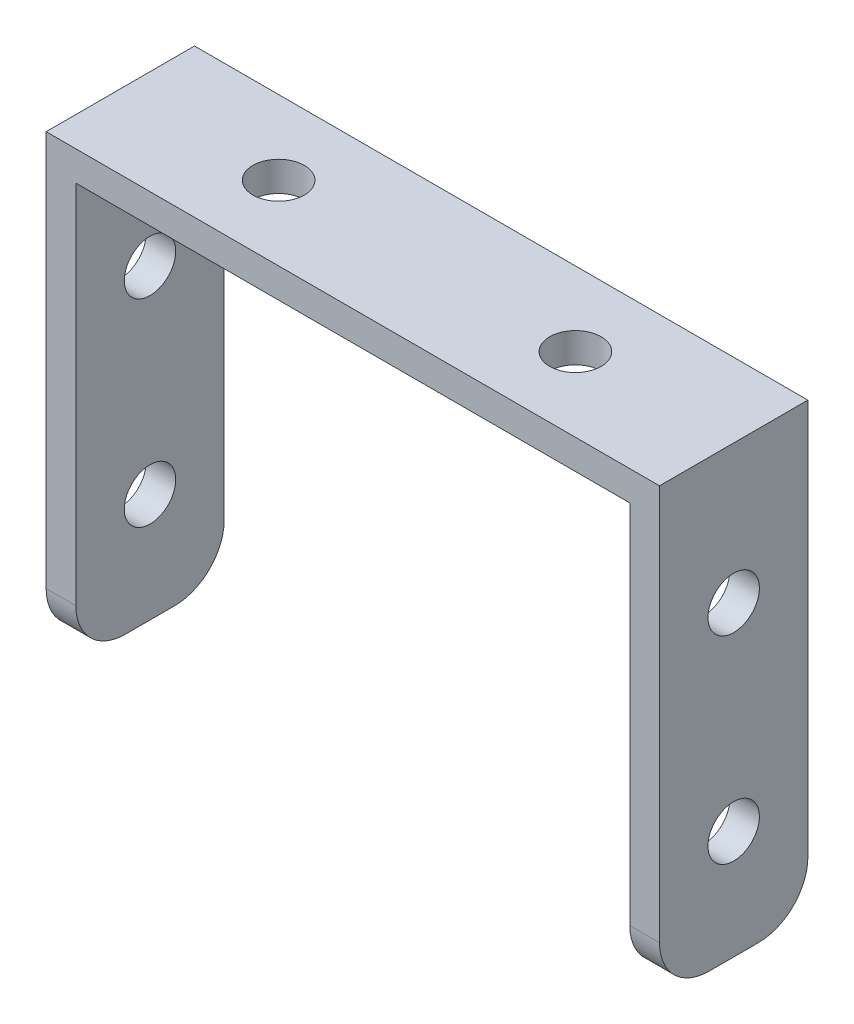
ISO-10303-21;
HEADER;
FILE_DESCRIPTION(('STEP AP214'),'2;1');
FILE_NAME('part.step','',(''),(''),'','','');
FILE_SCHEMA(('AUTOMOTIVE_DESIGN { 1 0 10303 214 1 1 1 1 }'));
ENDSEC;
DATA;
#1=APPLICATION_CONTEXT('core data for automotive mechanical design processes');
#2=APPLICATION_PROTOCOL_DEFINITION('international standard','automotive_design',2000,#1);
#3=PRODUCT_CONTEXT('',#1,'mechanical');
#4=PRODUCT('Part','Part','',(#3));
#5=PRODUCT_RELATED_PRODUCT_CATEGORY('part','',(#4));
#6=PRODUCT_DEFINITION_FORMATION('','',#4);
#7=PRODUCT_DEFINITION_CONTEXT('part definition',#1,'design');
#8=PRODUCT_DEFINITION('design','',#6,#7);
#9=PRODUCT_DEFINITION_SHAPE('','',#8);
#10=(LENGTH_UNIT() NAMED_UNIT(*) SI_UNIT(.MILLI.,.METRE.));
#11=(NAMED_UNIT(*) PLANE_ANGLE_UNIT() SI_UNIT($,.RADIAN.));
#12=(NAMED_UNIT(*) SI_UNIT($,.STERADIAN.) SOLID_ANGLE_UNIT());
#13=UNCERTAINTY_MEASURE_WITH_UNIT(LENGTH_MEASURE(1.E-05),#10,'distance_accuracy_value','');
#14=(GEOMETRIC_REPRESENTATION_CONTEXT(3) GLOBAL_UNCERTAINTY_ASSIGNED_CONTEXT((#13)) GLOBAL_UNIT_ASSIGNED_CONTEXT((#10,
#11,#12)) REPRESENTATION_CONTEXT('',''));
#15=CARTESIAN_POINT('',(0.,0.,0.));
#16=DIRECTION('',(0.,0.,1.));
#17=DIRECTION('',(1.,0.,0.));
#18=AXIS2_PLACEMENT_3D('',#15,#16,#17);
#19=CARTESIAN_POINT('',(-31.,0.,15.));
#20=DIRECTION('',(1.,0.,0.));
#21=DIRECTION('',(0.,0.,-1.));
#22=AXIS2_PLACEMENT_3D('',#19,#20,#21);
#23=PLANE('',#22);
#24=CARTESIAN_POINT('',(-31.,11.,7.5));
#25=DIRECTION('',(1.,0.,0.));
#26=DIRECTION('',(0.,0.,-1.));
#27=AXIS2_PLACEMENT_3D('',#24,#25,#26);
#28=CIRCLE('',#27,2.6);
#29=CARTESIAN_POINT('',(-31.,11.,4.9));
#30=VERTEX_POINT('',#29);
#31=EDGE_CURVE('E269',#30,#30,#28,.T.);
#32=ORIENTED_EDGE('',*,*,#31,.T.);
#33=EDGE_LOOP('',(#32));
#34=FACE_BOUND('',#33,.T.);
#35=CARTESIAN_POINT('',(-31.,31.,7.5));
#36=DIRECTION('',(1.,0.,0.));
#37=DIRECTION('',(0.,0.,-1.));
#38=AXIS2_PLACEMENT_3D('',#35,#36,#37);
#39=CIRCLE('',#38,2.6);
#40=CARTESIAN_POINT('',(-31.,31.,4.9));
#41=VERTEX_POINT('',#40);
#42=EDGE_CURVE('E273',#41,#41,#39,.T.);
#43=ORIENTED_EDGE('',*,*,#42,.T.);
#44=EDGE_LOOP('',(#43));
#45=FACE_BOUND('',#44,.T.);
#46=DIRECTION('',(0.,0.,-1.));
#47=VECTOR('',#46,1.);
#48=CARTESIAN_POINT('',(-31.,0.,15.));
#49=LINE('',#48,#47);
#50=CARTESIAN_POINT('',(-31.,0.,10.));
#51=VERTEX_POINT('',#50);
#52=CARTESIAN_POINT('',(-31.,0.,5.));
#53=VERTEX_POINT('',#52);
#54=EDGE_CURVE('E186',#51,#53,#49,.T.);
#55=ORIENTED_EDGE('',*,*,#54,.F.);
#56=CARTESIAN_POINT('',(-31.,5.,10.));
#57=DIRECTION('',(1.,0.,0.));
#58=DIRECTION('',(0.,0.,-1.));
#59=AXIS2_PLACEMENT_3D('',#56,#57,#58);
#60=CIRCLE('',#59,5.);
#61=CARTESIAN_POINT('',(-31.,5.,15.));
#62=VERTEX_POINT('',#61);
#63=EDGE_CURVE('E204',#51,#62,#60,.F.);
#64=ORIENTED_EDGE('',*,*,#63,.T.);
#65=DIRECTION('',(0.,-1.,0.));
#66=VECTOR('',#65,1.);
#67=CARTESIAN_POINT('',(-31.,0.,15.));
#68=LINE('',#67,#66);
#69=CARTESIAN_POINT('',(-31.,45.,15.));
#70=VERTEX_POINT('',#69);
#71=EDGE_CURVE('E135',#70,#62,#68,.T.);
#72=ORIENTED_EDGE('',*,*,#71,.F.);
#73=DIRECTION('',(0.,0.,-1.));
#74=VECTOR('',#73,1.);
#75=CARTESIAN_POINT('',(-31.,45.,15.));
#76=LINE('',#75,#74);
#77=CARTESIAN_POINT('',(-31.,45.,0.));
#78=VERTEX_POINT('',#77);
#79=EDGE_CURVE('E159',#70,#78,#76,.T.);
#80=ORIENTED_EDGE('',*,*,#79,.T.);
#81=DIRECTION('',(0.,-1.,0.));
#82=VECTOR('',#81,1.);
#83=CARTESIAN_POINT('',(-31.,0.,0.));
#84=LINE('',#83,#82);
#85=CARTESIAN_POINT('',(-31.,5.,0.));
#86=VERTEX_POINT('',#85);
#87=EDGE_CURVE('E160',#78,#86,#84,.T.);
#88=ORIENTED_EDGE('',*,*,#87,.T.);
#89=CARTESIAN_POINT('',(-31.,5.,5.));
#90=DIRECTION('',(1.,0.,0.));
#91=DIRECTION('',(0.,0.,-1.));
#92=AXIS2_PLACEMENT_3D('',#89,#90,#91);
#93=CIRCLE('',#92,5.);
#94=EDGE_CURVE('E202',#86,#53,#93,.F.);
#95=ORIENTED_EDGE('',*,*,#94,.T.);
#96=EDGE_LOOP('',(#55,#64,#72,#80,#88,#95));
#97=FACE_BOUND('',#96,.T.);
#98=ADVANCED_FACE('F35',(#34,#45,#97),#23,.F.);
#99=CARTESIAN_POINT('',(-31.,0.,15.));
#100=DIRECTION('',(0.,1.,0.));
#101=DIRECTION('',(-1.,0.,0.));
#102=AXIS2_PLACEMENT_3D('',#99,#100,#101);
#103=PLANE('',#102);
#104=DIRECTION('',(0.,0.,-1.));
#105=VECTOR('',#104,1.);
#106=CARTESIAN_POINT('',(-28.,0.,15.));
#107=LINE('',#106,#105);
#108=CARTESIAN_POINT('',(-28.,0.,10.));
#109=VERTEX_POINT('',#108);
#110=CARTESIAN_POINT('',(-28.,0.,5.));
#111=VERTEX_POINT('',#110);
#112=EDGE_CURVE('E144',#109,#111,#107,.T.);
#113=ORIENTED_EDGE('',*,*,#112,.F.);
#114=DIRECTION('',(1.,0.,0.));
#115=VECTOR('',#114,1.);
#116=CARTESIAN_POINT('',(-31.,0.,10.));
#117=LINE('',#116,#115);
#118=EDGE_CURVE('E200',#109,#51,#117,.F.);
#119=ORIENTED_EDGE('',*,*,#118,.T.);
#120=ORIENTED_EDGE('',*,*,#54,.T.);
#121=DIRECTION('',(1.,0.,0.));
#122=VECTOR('',#121,1.);
#123=CARTESIAN_POINT('',(-28.,0.,5.));
#124=LINE('',#123,#122);
#125=EDGE_CURVE('E197',#53,#111,#124,.T.);
#126=ORIENTED_EDGE('',*,*,#125,.T.);
#127=EDGE_LOOP('',(#113,#119,#120,#126));
#128=FACE_BOUND('',#127,.T.);
#129=ADVANCED_FACE('F295',(#128),#103,.F.);
#130=CARTESIAN_POINT('',(-28.,0.,15.));
#131=DIRECTION('',(-1.,0.,0.));
#132=DIRECTION('',(0.,0.,1.));
#133=AXIS2_PLACEMENT_3D('',#130,#131,#132);
#134=PLANE('',#133);
#135=CARTESIAN_POINT('',(-28.,11.,7.5));
#136=DIRECTION('',(-1.,0.,0.));
#137=DIRECTION('',(0.,0.,1.));
#138=AXIS2_PLACEMENT_3D('',#135,#136,#137);
#139=CIRCLE('',#138,2.6);
#140=CARTESIAN_POINT('',(-28.,11.,10.1));
#141=VERTEX_POINT('',#140);
#142=EDGE_CURVE('E255',#141,#141,#139,.T.);
#143=ORIENTED_EDGE('',*,*,#142,.T.);
#144=EDGE_LOOP('',(#143));
#145=FACE_BOUND('',#144,.T.);
#146=CARTESIAN_POINT('',(-28.,31.,7.5));
#147=DIRECTION('',(-1.,0.,0.));
#148=DIRECTION('',(0.,0.,1.));
#149=AXIS2_PLACEMENT_3D('',#146,#147,#148);
#150=CIRCLE('',#149,2.6);
#151=CARTESIAN_POINT('',(-28.,31.,10.1));
#152=VERTEX_POINT('',#151);
#153=EDGE_CURVE('E263',#152,#152,#150,.T.);
#154=ORIENTED_EDGE('',*,*,#153,.T.);
#155=EDGE_LOOP('',(#154));
#156=FACE_BOUND('',#155,.T.);
#157=DIRECTION('',(0.,1.,0.));
#158=VECTOR('',#157,1.);
#159=CARTESIAN_POINT('',(-28.,0.,15.));
#160=LINE('',#159,#158);
#161=CARTESIAN_POINT('',(-28.,5.,15.));
#162=VERTEX_POINT('',#161);
#163=CARTESIAN_POINT('',(-28.,42.,15.));
#164=VERTEX_POINT('',#163);
#165=EDGE_CURVE('E124',#162,#164,#160,.T.);
#166=ORIENTED_EDGE('',*,*,#165,.F.);
#167=CARTESIAN_POINT('',(-28.,5.,10.));
#168=DIRECTION('',(-1.,0.,0.));
#169=DIRECTION('',(0.,0.,1.));
#170=AXIS2_PLACEMENT_3D('',#167,#168,#169);
#171=CIRCLE('',#170,5.);
#172=EDGE_CURVE('E195',#162,#109,#171,.F.);
#173=ORIENTED_EDGE('',*,*,#172,.T.);
#174=ORIENTED_EDGE('',*,*,#112,.T.);
#175=CARTESIAN_POINT('',(-28.,5.,5.));
#176=DIRECTION('',(-1.,0.,0.));
#177=DIRECTION('',(0.,0.,1.));
#178=AXIS2_PLACEMENT_3D('',#175,#176,#177);
#179=CIRCLE('',#178,5.);
#180=CARTESIAN_POINT('',(-28.,5.,0.));
#181=VERTEX_POINT('',#180);
#182=EDGE_CURVE('E193',#111,#181,#179,.F.);
#183=ORIENTED_EDGE('',*,*,#182,.T.);
#184=DIRECTION('',(0.,1.,0.));
#185=VECTOR('',#184,1.);
#186=CARTESIAN_POINT('',(-28.,0.,0.));
#187=LINE('',#186,#185);
#188=CARTESIAN_POINT('',(-28.,42.,0.));
#189=VERTEX_POINT('',#188);
#190=EDGE_CURVE('E141',#181,#189,#187,.T.);
#191=ORIENTED_EDGE('',*,*,#190,.T.);
#192=DIRECTION('',(0.,0.,-1.));
#193=VECTOR('',#192,1.);
#194=CARTESIAN_POINT('',(-28.,42.,15.));
#195=LINE('',#194,#193);
#196=EDGE_CURVE('E138',#164,#189,#195,.T.);
#197=ORIENTED_EDGE('',*,*,#196,.F.);
#198=EDGE_LOOP('',(#166,#173,#174,#183,#191,#197));
#199=FACE_BOUND('',#198,.T.);
#200=ADVANCED_FACE('F139',(#145,#156,#199),#134,.F.);
#201=CARTESIAN_POINT('',(-28.,42.,15.));
#202=DIRECTION('',(0.,1.,0.));
#203=DIRECTION('',(0.,0.,1.));
#204=AXIS2_PLACEMENT_3D('',#201,#202,#203);
#205=PLANE('',#204);
#206=CARTESIAN_POINT('',(-15.,42.,7.5));
#207=DIRECTION('',(0.,1.,0.));
#208=DIRECTION('',(0.,0.,1.));
#209=AXIS2_PLACEMENT_3D('',#206,#207,#208);
#210=CIRCLE('',#209,2.6);
#211=CARTESIAN_POINT('',(-15.,42.,10.1));
#212=VERTEX_POINT('',#211);
#213=EDGE_CURVE('E163',#212,#212,#210,.T.);
#214=ORIENTED_EDGE('',*,*,#213,.T.);
#215=EDGE_LOOP('',(#214));
#216=FACE_BOUND('',#215,.T.);
#217=CARTESIAN_POINT('',(15.,42.,7.5));
#218=DIRECTION('',(0.,1.,0.));
#219=DIRECTION('',(0.,0.,1.));
#220=AXIS2_PLACEMENT_3D('',#217,#218,#219);
#221=CIRCLE('',#220,2.6);
#222=CARTESIAN_POINT('',(15.,42.,10.1));
#223=VERTEX_POINT('',#222);
#224=EDGE_CURVE('E248',#223,#223,#221,.T.);
#225=ORIENTED_EDGE('',*,*,#224,.T.);
#226=EDGE_LOOP('',(#225));
#227=FACE_BOUND('',#226,.T.);
#228=DIRECTION('',(1.,0.,0.));
#229=VECTOR('',#228,1.);
#230=CARTESIAN_POINT('',(-28.,42.,0.));
#231=LINE('',#230,#229);
#232=CARTESIAN_POINT('',(28.,42.,0.));
#233=VERTEX_POINT('',#232);
#234=EDGE_CURVE('E165',#189,#233,#231,.T.);
#235=ORIENTED_EDGE('',*,*,#234,.T.);
#236=DIRECTION('',(0.,0.,-1.));
#237=VECTOR('',#236,1.);
#238=CARTESIAN_POINT('',(28.,42.,15.));
#239=LINE('',#238,#237);
#240=CARTESIAN_POINT('',(28.,42.,15.));
#241=VERTEX_POINT('',#240);
#242=EDGE_CURVE('E145',#241,#233,#239,.T.);
#243=ORIENTED_EDGE('',*,*,#242,.F.);
#244=DIRECTION('',(1.,0.,0.));
#245=VECTOR('',#244,1.);
#246=CARTESIAN_POINT('',(-28.,42.,15.));
#247=LINE('',#246,#245);
#248=EDGE_CURVE('E130',#164,#241,#247,.T.);
#249=ORIENTED_EDGE('',*,*,#248,.F.);
#250=ORIENTED_EDGE('',*,*,#196,.T.);
#251=EDGE_LOOP('',(#235,#243,#249,#250));
#252=FACE_BOUND('',#251,.T.);
#253=ADVANCED_FACE('F147',(#216,#227,#252),#205,.F.);
#254=CARTESIAN_POINT('',(28.,0.,15.));
#255=DIRECTION('',(1.,0.,0.));
#256=DIRECTION('',(0.,0.,-1.));
#257=AXIS2_PLACEMENT_3D('',#254,#255,#256);
#258=PLANE('',#257);
#259=CARTESIAN_POINT('',(28.,11.,7.5));
#260=DIRECTION('',(1.,0.,0.));
#261=DIRECTION('',(0.,0.,-1.));
#262=AXIS2_PLACEMENT_3D('',#259,#260,#261);
#263=CIRCLE('',#262,2.6);
#264=CARTESIAN_POINT('',(28.,11.,4.9));
#265=VERTEX_POINT('',#264);
#266=EDGE_CURVE('E260',#265,#265,#263,.T.);
#267=ORIENTED_EDGE('',*,*,#266,.T.);
#268=EDGE_LOOP('',(#267));
#269=FACE_BOUND('',#268,.T.);
#270=CARTESIAN_POINT('',(28.,31.,7.5));
#271=DIRECTION('',(1.,0.,0.));
#272=DIRECTION('',(0.,0.,-1.));
#273=AXIS2_PLACEMENT_3D('',#270,#271,#272);
#274=CIRCLE('',#273,2.6);
#275=CARTESIAN_POINT('',(28.,31.,4.9));
#276=VERTEX_POINT('',#275);
#277=EDGE_CURVE('E266',#276,#276,#274,.T.);
#278=ORIENTED_EDGE('',*,*,#277,.T.);
#279=EDGE_LOOP('',(#278));
#280=FACE_BOUND('',#279,.T.);
#281=DIRECTION('',(0.,-1.,0.));
#282=VECTOR('',#281,1.);
#283=CARTESIAN_POINT('',(28.,0.,0.));
#284=LINE('',#283,#282);
#285=CARTESIAN_POINT('',(28.,5.,0.));
#286=VERTEX_POINT('',#285);
#287=EDGE_CURVE('E167',#233,#286,#284,.T.);
#288=ORIENTED_EDGE('',*,*,#287,.T.);
#289=CARTESIAN_POINT('',(28.,5.,5.));
#290=DIRECTION('',(1.,0.,0.));
#291=DIRECTION('',(0.,0.,-1.));
#292=AXIS2_PLACEMENT_3D('',#289,#290,#291);
#293=CIRCLE('',#292,5.);
#294=CARTESIAN_POINT('',(28.,0.,5.));
#295=VERTEX_POINT('',#294);
#296=EDGE_CURVE('E11',#286,#295,#293,.F.);
#297=ORIENTED_EDGE('',*,*,#296,.T.);
#298=DIRECTION('',(0.,0.,-1.));
#299=VECTOR('',#298,1.);
#300=CARTESIAN_POINT('',(28.,0.,15.));
#301=LINE('',#300,#299);
#302=CARTESIAN_POINT('',(28.,0.,10.));
#303=VERTEX_POINT('',#302);
#304=EDGE_CURVE('E181',#303,#295,#301,.T.);
#305=ORIENTED_EDGE('',*,*,#304,.F.);
#306=CARTESIAN_POINT('',(28.,5.,10.));
#307=DIRECTION('',(1.,0.,0.));
#308=DIRECTION('',(0.,0.,-1.));
#309=AXIS2_PLACEMENT_3D('',#306,#307,#308);
#310=CIRCLE('',#309,5.);
#311=CARTESIAN_POINT('',(28.,5.,15.));
#312=VERTEX_POINT('',#311);
#313=EDGE_CURVE('E43',#303,#312,#310,.F.);
#314=ORIENTED_EDGE('',*,*,#313,.T.);
#315=DIRECTION('',(0.,-1.,0.));
#316=VECTOR('',#315,1.);
#317=CARTESIAN_POINT('',(28.,0.,15.));
#318=LINE('',#317,#316);
#319=EDGE_CURVE('E150',#241,#312,#318,.T.);
#320=ORIENTED_EDGE('',*,*,#319,.F.);
#321=ORIENTED_EDGE('',*,*,#242,.T.);
#322=EDGE_LOOP('',(#288,#297,#305,#314,#320,#321));
#323=FACE_BOUND('',#322,.T.);
#324=ADVANCED_FACE('F218',(#269,#280,#323),#258,.F.);
#325=CARTESIAN_POINT('',(31.,0.,15.));
#326=DIRECTION('',(0.,1.,0.));
#327=DIRECTION('',(-1.,0.,0.));
#328=AXIS2_PLACEMENT_3D('',#325,#326,#327);
#329=PLANE('',#328);
#330=ORIENTED_EDGE('',*,*,#304,.T.);
#331=DIRECTION('',(1.,0.,0.));
#332=VECTOR('',#331,1.);
#333=CARTESIAN_POINT('',(31.,0.,5.));
#334=LINE('',#333,#332);
#335=CARTESIAN_POINT('',(31.,0.,5.));
#336=VERTEX_POINT('',#335);
#337=EDGE_CURVE('E211',#295,#336,#334,.T.);
#338=ORIENTED_EDGE('',*,*,#337,.T.);
#339=DIRECTION('',(0.,0.,-1.));
#340=VECTOR('',#339,1.);
#341=CARTESIAN_POINT('',(31.,0.,15.));
#342=LINE('',#341,#340);
#343=CARTESIAN_POINT('',(31.,0.,10.));
#344=VERTEX_POINT('',#343);
#345=EDGE_CURVE('E178',#344,#336,#342,.T.);
#346=ORIENTED_EDGE('',*,*,#345,.F.);
#347=DIRECTION('',(1.,0.,0.));
#348=VECTOR('',#347,1.);
#349=CARTESIAN_POINT('',(31.,0.,10.));
#350=LINE('',#349,#348);
#351=EDGE_CURVE('E55',#344,#303,#350,.F.);
#352=ORIENTED_EDGE('',*,*,#351,.T.);
#353=EDGE_LOOP('',(#330,#338,#346,#352));
#354=FACE_BOUND('',#353,.T.);
#355=ADVANCED_FACE('F225',(#354),#329,.F.);
#356=CARTESIAN_POINT('',(31.,0.,15.));
#357=DIRECTION('',(-1.,0.,0.));
#358=DIRECTION('',(0.,0.,1.));
#359=AXIS2_PLACEMENT_3D('',#356,#357,#358);
#360=PLANE('',#359);
#361=CARTESIAN_POINT('',(31.,11.,7.5));
#362=DIRECTION('',(1.,0.,0.));
#363=DIRECTION('',(0.,0.,-1.));
#364=AXIS2_PLACEMENT_3D('',#361,#362,#363);
#365=CIRCLE('',#364,2.6);
#366=CARTESIAN_POINT('',(31.,11.,4.9));
#367=VERTEX_POINT('',#366);
#368=EDGE_CURVE('E276',#367,#367,#365,.T.);
#369=ORIENTED_EDGE('',*,*,#368,.F.);
#370=EDGE_LOOP('',(#369));
#371=FACE_BOUND('',#370,.T.);
#372=CARTESIAN_POINT('',(31.,31.,7.5));
#373=DIRECTION('',(1.,0.,0.));
#374=DIRECTION('',(0.,0.,-1.));
#375=AXIS2_PLACEMENT_3D('',#372,#373,#374);
#376=CIRCLE('',#375,2.6);
#377=CARTESIAN_POINT('',(31.,31.,4.9));
#378=VERTEX_POINT('',#377);
#379=EDGE_CURVE('E270',#378,#378,#376,.T.);
#380=ORIENTED_EDGE('',*,*,#379,.F.);
#381=EDGE_LOOP('',(#380));
#382=FACE_BOUND('',#381,.T.);
#383=ORIENTED_EDGE('',*,*,#345,.T.);
#384=CARTESIAN_POINT('',(31.,5.,5.));
#385=DIRECTION('',(-1.,0.,0.));
#386=DIRECTION('',(0.,0.,1.));
#387=AXIS2_PLACEMENT_3D('',#384,#385,#386);
#388=CIRCLE('',#387,5.);
#389=CARTESIAN_POINT('',(31.,5.,0.));
#390=VERTEX_POINT('',#389);
#391=EDGE_CURVE('E216',#336,#390,#388,.F.);
#392=ORIENTED_EDGE('',*,*,#391,.T.);
#393=DIRECTION('',(0.,1.,0.));
#394=VECTOR('',#393,1.);
#395=CARTESIAN_POINT('',(31.,0.,0.));
#396=LINE('',#395,#394);
#397=CARTESIAN_POINT('',(31.,45.,0.));
#398=VERTEX_POINT('',#397);
#399=EDGE_CURVE('E169',#390,#398,#396,.T.);
#400=ORIENTED_EDGE('',*,*,#399,.T.);
#401=DIRECTION('',(0.,0.,-1.));
#402=VECTOR('',#401,1.);
#403=CARTESIAN_POINT('',(31.,45.,15.));
#404=LINE('',#403,#402);
#405=CARTESIAN_POINT('',(31.,45.,15.));
#406=VERTEX_POINT('',#405);
#407=EDGE_CURVE('E175',#406,#398,#404,.T.);
#408=ORIENTED_EDGE('',*,*,#407,.F.);
#409=DIRECTION('',(0.,1.,0.));
#410=VECTOR('',#409,1.);
#411=CARTESIAN_POINT('',(31.,0.,15.));
#412=LINE('',#411,#410);
#413=CARTESIAN_POINT('',(31.,5.,15.));
#414=VERTEX_POINT('',#413);
#415=EDGE_CURVE('E152',#414,#406,#412,.T.);
#416=ORIENTED_EDGE('',*,*,#415,.F.);
#417=CARTESIAN_POINT('',(31.,5.,10.));
#418=DIRECTION('',(-1.,0.,0.));
#419=DIRECTION('',(0.,0.,1.));
#420=AXIS2_PLACEMENT_3D('',#417,#418,#419);
#421=CIRCLE('',#420,5.);
#422=EDGE_CURVE('E214',#414,#344,#421,.F.);
#423=ORIENTED_EDGE('',*,*,#422,.T.);
#424=EDGE_LOOP('',(#383,#392,#400,#408,#416,#423));
#425=FACE_BOUND('',#424,.T.);
#426=ADVANCED_FACE('F223',(#371,#382,#425),#360,.F.);
#427=CARTESIAN_POINT('',(-31.,45.,15.));
#428=DIRECTION('',(0.,-1.,0.));
#429=DIRECTION('',(0.,0.,-1.));
#430=AXIS2_PLACEMENT_3D('',#427,#428,#429);
#431=PLANE('',#430);
#432=CARTESIAN_POINT('',(-15.,45.,7.5));
#433=DIRECTION('',(0.,1.,0.));
#434=DIRECTION('',(0.,0.,1.));
#435=AXIS2_PLACEMENT_3D('',#432,#433,#434);
#436=CIRCLE('',#435,2.6);
#437=CARTESIAN_POINT('',(-15.,45.,10.1));
#438=VERTEX_POINT('',#437);
#439=EDGE_CURVE('E251',#438,#438,#436,.T.);
#440=ORIENTED_EDGE('',*,*,#439,.F.);
#441=EDGE_LOOP('',(#440));
#442=FACE_BOUND('',#441,.T.);
#443=CARTESIAN_POINT('',(15.,45.,7.5));
#444=DIRECTION('',(0.,1.,0.));
#445=DIRECTION('',(0.,0.,1.));
#446=AXIS2_PLACEMENT_3D('',#443,#444,#445);
#447=CIRCLE('',#446,2.6);
#448=CARTESIAN_POINT('',(15.,45.,10.1));
#449=VERTEX_POINT('',#448);
#450=EDGE_CURVE('E252',#449,#449,#447,.T.);
#451=ORIENTED_EDGE('',*,*,#450,.F.);
#452=EDGE_LOOP('',(#451));
#453=FACE_BOUND('',#452,.T.);
#454=DIRECTION('',(-1.,0.,0.));
#455=VECTOR('',#454,1.);
#456=CARTESIAN_POINT('',(-31.,45.,0.));
#457=LINE('',#456,#455);
#458=EDGE_CURVE('E171',#398,#78,#457,.T.);
#459=ORIENTED_EDGE('',*,*,#458,.T.);
#460=ORIENTED_EDGE('',*,*,#79,.F.);
#461=DIRECTION('',(-1.,0.,0.));
#462=VECTOR('',#461,1.);
#463=CARTESIAN_POINT('',(-31.,45.,15.));
#464=LINE('',#463,#462);
#465=EDGE_CURVE('E157',#406,#70,#464,.T.);
#466=ORIENTED_EDGE('',*,*,#465,.F.);
#467=ORIENTED_EDGE('',*,*,#407,.T.);
#468=EDGE_LOOP('',(#459,#460,#466,#467));
#469=FACE_BOUND('',#468,.T.);
#470=ADVANCED_FACE('F238',(#442,#453,#469),#431,.F.);
#471=CARTESIAN_POINT('',(0.,0.,15.));
#472=DIRECTION('',(0.,0.,-1.));
#473=DIRECTION('',(-1.,0.,0.));
#474=AXIS2_PLACEMENT_3D('',#471,#472,#473);
#475=PLANE('',#474);
#476=ORIENTED_EDGE('',*,*,#71,.T.);
#477=DIRECTION('',(1.,0.,0.));
#478=VECTOR('',#477,1.);
#479=CARTESIAN_POINT('',(0.,4.99999999999998,15.));
#480=LINE('',#479,#478);
#481=EDGE_CURVE('E133',#62,#162,#480,.T.);
#482=ORIENTED_EDGE('',*,*,#481,.T.);
#483=ORIENTED_EDGE('',*,*,#165,.T.);
#484=ORIENTED_EDGE('',*,*,#248,.T.);
#485=ORIENTED_EDGE('',*,*,#319,.T.);
#486=DIRECTION('',(1.,0.,0.));
#487=VECTOR('',#486,1.);
#488=CARTESIAN_POINT('',(0.,4.99999999999998,15.));
#489=LINE('',#488,#487);
#490=EDGE_CURVE('E189',#312,#414,#489,.T.);
#491=ORIENTED_EDGE('',*,*,#490,.T.);
#492=ORIENTED_EDGE('',*,*,#415,.T.);
#493=ORIENTED_EDGE('',*,*,#465,.T.);
#494=EDGE_LOOP('',(#476,#482,#483,#484,#485,#491,#492,#493));
#495=FACE_BOUND('',#494,.T.);
#496=ADVANCED_FACE('F127',(#495),#475,.F.);
#497=CARTESIAN_POINT('',(0.,0.,0.));
#498=DIRECTION('',(0.,0.,-1.));
#499=DIRECTION('',(-1.,0.,0.));
#500=AXIS2_PLACEMENT_3D('',#497,#498,#499);
#501=PLANE('',#500);
#502=ORIENTED_EDGE('',*,*,#190,.F.);
#503=DIRECTION('',(1.,0.,0.));
#504=VECTOR('',#503,1.);
#505=CARTESIAN_POINT('',(-31.,5.,0.));
#506=LINE('',#505,#504);
#507=EDGE_CURVE('E208',#181,#86,#506,.F.);
#508=ORIENTED_EDGE('',*,*,#507,.T.);
#509=ORIENTED_EDGE('',*,*,#87,.F.);
#510=ORIENTED_EDGE('',*,*,#458,.F.);
#511=ORIENTED_EDGE('',*,*,#399,.F.);
#512=DIRECTION('',(1.,0.,0.));
#513=VECTOR('',#512,1.);
#514=CARTESIAN_POINT('',(28.,5.,0.));
#515=LINE('',#514,#513);
#516=EDGE_CURVE('E206',#390,#286,#515,.F.);
#517=ORIENTED_EDGE('',*,*,#516,.T.);
#518=ORIENTED_EDGE('',*,*,#287,.F.);
#519=ORIENTED_EDGE('',*,*,#234,.F.);
#520=EDGE_LOOP('',(#502,#508,#509,#510,#511,#517,#518,#519));
#521=FACE_BOUND('',#520,.T.);
#522=ADVANCED_FACE('F233',(#521),#501,.T.);
#523=CARTESIAN_POINT('',(15.,30.,7.5));
#524=DIRECTION('',(0.,1.,0.));
#525=DIRECTION('',(0.,0.,1.));
#526=AXIS2_PLACEMENT_3D('',#523,#524,#525);
#527=CYLINDRICAL_SURFACE('',#526,2.6);
#528=ORIENTED_EDGE('',*,*,#450,.T.);
#529=EDGE_LOOP('',(#528));
#530=FACE_BOUND('',#529,.T.);
#531=ORIENTED_EDGE('',*,*,#224,.F.);
#532=EDGE_LOOP('',(#531));
#533=FACE_BOUND('',#532,.T.);
#534=ADVANCED_FACE('F358',(#530,#533),#527,.F.);
#535=CARTESIAN_POINT('',(-15.,30.,7.5));
#536=DIRECTION('',(0.,1.,0.));
#537=DIRECTION('',(0.,0.,1.));
#538=AXIS2_PLACEMENT_3D('',#535,#536,#537);
#539=CYLINDRICAL_SURFACE('',#538,2.6);
#540=ORIENTED_EDGE('',*,*,#439,.T.);
#541=EDGE_LOOP('',(#540));
#542=FACE_BOUND('',#541,.T.);
#543=ORIENTED_EDGE('',*,*,#213,.F.);
#544=EDGE_LOOP('',(#543));
#545=FACE_BOUND('',#544,.T.);
#546=ADVANCED_FACE('F310',(#542,#545),#539,.F.);
#547=CARTESIAN_POINT('',(-31.,31.,7.5));
#548=DIRECTION('',(1.,0.,0.));
#549=DIRECTION('',(0.,0.,-1.));
#550=AXIS2_PLACEMENT_3D('',#547,#548,#549);
#551=CYLINDRICAL_SURFACE('',#550,2.6);
#552=ORIENTED_EDGE('',*,*,#379,.T.);
#553=EDGE_LOOP('',(#552));
#554=FACE_BOUND('',#553,.T.);
#555=ORIENTED_EDGE('',*,*,#277,.F.);
#556=EDGE_LOOP('',(#555));
#557=FACE_BOUND('',#556,.T.);
#558=ADVANCED_FACE('F302',(#554,#557),#551,.F.);
#559=CARTESIAN_POINT('',(-31.,11.,7.5));
#560=DIRECTION('',(1.,0.,0.));
#561=DIRECTION('',(0.,0.,-1.));
#562=AXIS2_PLACEMENT_3D('',#559,#560,#561);
#563=CYLINDRICAL_SURFACE('',#562,2.6);
#564=ORIENTED_EDGE('',*,*,#368,.T.);
#565=EDGE_LOOP('',(#564));
#566=FACE_BOUND('',#565,.T.);
#567=ORIENTED_EDGE('',*,*,#266,.F.);
#568=EDGE_LOOP('',(#567));
#569=FACE_BOUND('',#568,.T.);
#570=ADVANCED_FACE('F290',(#566,#569),#563,.F.);
#571=ORIENTED_EDGE('',*,*,#42,.F.);
#572=EDGE_LOOP('',(#571));
#573=FACE_BOUND('',#572,.T.);
#574=ORIENTED_EDGE('',*,*,#153,.F.);
#575=EDGE_LOOP('',(#574));
#576=FACE_BOUND('',#575,.T.);
#577=ADVANCED_FACE('F288',(#573,#576),#551,.F.);
#578=ORIENTED_EDGE('',*,*,#31,.F.);
#579=EDGE_LOOP('',(#578));
#580=FACE_BOUND('',#579,.T.);
#581=ORIENTED_EDGE('',*,*,#142,.F.);
#582=EDGE_LOOP('',(#581));
#583=FACE_BOUND('',#582,.T.);
#584=ADVANCED_FACE('F284',(#580,#583),#563,.F.);
#585=CARTESIAN_POINT('',(0.,4.99999999999998,10.));
#586=DIRECTION('',(1.,0.,0.));
#587=DIRECTION('',(0.,1.,0.));
#588=AXIS2_PLACEMENT_3D('',#585,#586,#587);
#589=CYLINDRICAL_SURFACE('',#588,5.);
#590=ORIENTED_EDGE('',*,*,#63,.F.);
#591=ORIENTED_EDGE('',*,*,#118,.F.);
#592=ORIENTED_EDGE('',*,*,#172,.F.);
#593=ORIENTED_EDGE('',*,*,#481,.F.);
#594=EDGE_LOOP('',(#590,#591,#592,#593));
#595=FACE_BOUND('',#594,.T.);
#596=ADVANCED_FACE('F287',(#595),#589,.T.);
#597=CARTESIAN_POINT('',(-31.,5.,5.));
#598=DIRECTION('',(-1.,0.,0.));
#599=DIRECTION('',(0.,-1.,0.));
#600=AXIS2_PLACEMENT_3D('',#597,#598,#599);
#601=CYLINDRICAL_SURFACE('',#600,5.);
#602=ORIENTED_EDGE('',*,*,#94,.F.);
#603=ORIENTED_EDGE('',*,*,#507,.F.);
#604=ORIENTED_EDGE('',*,*,#182,.F.);
#605=ORIENTED_EDGE('',*,*,#125,.F.);
#606=EDGE_LOOP('',(#602,#603,#604,#605));
#607=FACE_BOUND('',#606,.T.);
#608=ADVANCED_FACE('F322',(#607),#601,.T.);
#609=CARTESIAN_POINT('',(31.,5.,5.));
#610=DIRECTION('',(-1.,0.,0.));
#611=DIRECTION('',(0.,-1.,0.));
#612=AXIS2_PLACEMENT_3D('',#609,#610,#611);
#613=CYLINDRICAL_SURFACE('',#612,5.);
#614=ORIENTED_EDGE('',*,*,#296,.F.);
#615=ORIENTED_EDGE('',*,*,#516,.F.);
#616=ORIENTED_EDGE('',*,*,#391,.F.);
#617=ORIENTED_EDGE('',*,*,#337,.F.);
#618=EDGE_LOOP('',(#614,#615,#616,#617));
#619=FACE_BOUND('',#618,.T.);
#620=ADVANCED_FACE('F228',(#619),#613,.T.);
#621=CARTESIAN_POINT('',(0.,4.99999999999998,10.));
#622=DIRECTION('',(1.,0.,0.));
#623=DIRECTION('',(0.,1.,0.));
#624=AXIS2_PLACEMENT_3D('',#621,#622,#623);
#625=CYLINDRICAL_SURFACE('',#624,5.);
#626=ORIENTED_EDGE('',*,*,#313,.F.);
#627=ORIENTED_EDGE('',*,*,#351,.F.);
#628=ORIENTED_EDGE('',*,*,#422,.F.);
#629=ORIENTED_EDGE('',*,*,#490,.F.);
#630=EDGE_LOOP('',(#626,#627,#628,#629));
#631=FACE_BOUND('',#630,.T.);
#632=ADVANCED_FACE('F37',(#631),#625,.T.);
#633=CLOSED_SHELL('',(#98,#129,#200,#253,#324,#355,#426,#470,#496,#522,#534,#546,#558,#570,#577,
#584,#596,#608,#620,#632));
#634=MANIFOLD_SOLID_BREP('B2',#633);
#635=ADVANCED_BREP_SHAPE_REPRESENTATION('',(#18,#634),#14);
#636=SHAPE_DEFINITION_REPRESENTATION(#9,#635);
ENDSEC;
END-ISO-10303-21;
